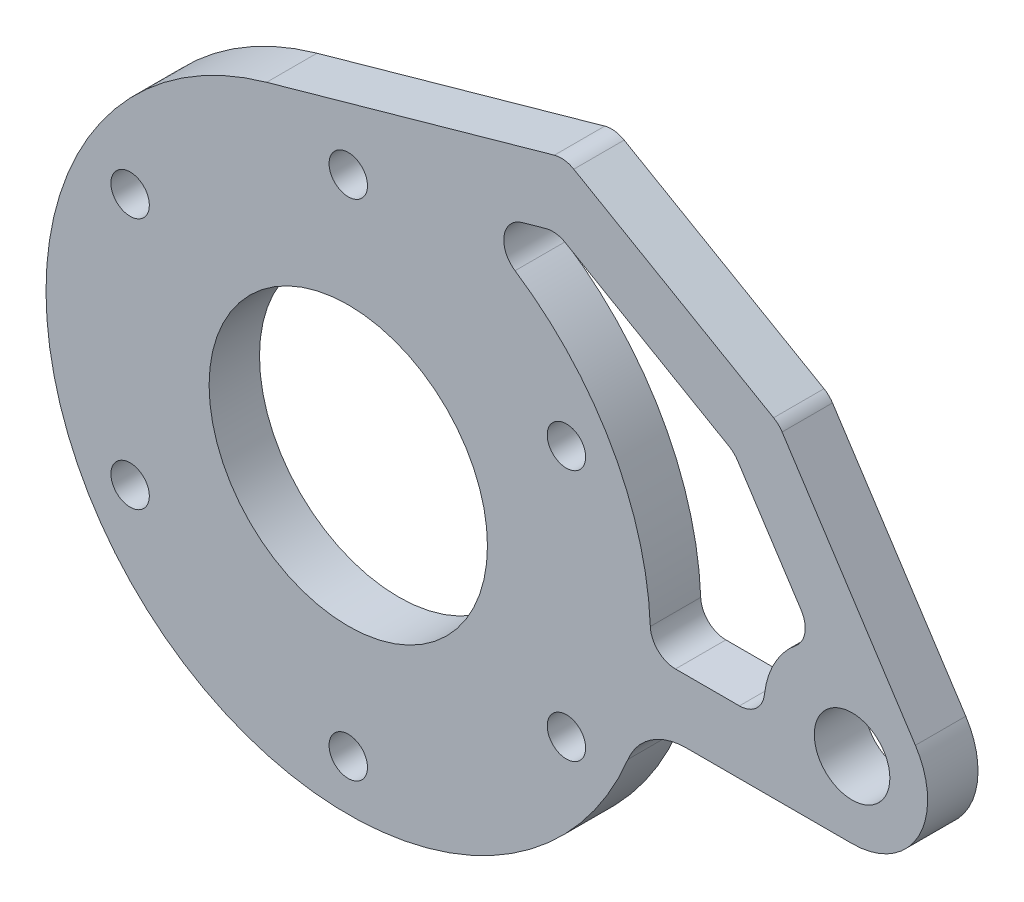
ISO-10303-21;
HEADER;
FILE_DESCRIPTION(('STEP AP214'),'2;1');
FILE_NAME('part.step','',(''),(''),'','','');
FILE_SCHEMA(('AUTOMOTIVE_DESIGN { 1 0 10303 214 1 1 1 1 }'));
ENDSEC;
DATA;
#1=APPLICATION_CONTEXT('core data for automotive mechanical design processes');
#2=APPLICATION_PROTOCOL_DEFINITION('international standard','automotive_design',2000,#1);
#3=PRODUCT_CONTEXT('',#1,'mechanical');
#4=PRODUCT('Part','Part','',(#3));
#5=PRODUCT_RELATED_PRODUCT_CATEGORY('part','',(#4));
#6=PRODUCT_DEFINITION_FORMATION('','',#4);
#7=PRODUCT_DEFINITION_CONTEXT('part definition',#1,'design');
#8=PRODUCT_DEFINITION('design','',#6,#7);
#9=PRODUCT_DEFINITION_SHAPE('','',#8);
#10=(LENGTH_UNIT() NAMED_UNIT(*) SI_UNIT(.MILLI.,.METRE.));
#11=(NAMED_UNIT(*) PLANE_ANGLE_UNIT() SI_UNIT($,.RADIAN.));
#12=(NAMED_UNIT(*) SI_UNIT($,.STERADIAN.) SOLID_ANGLE_UNIT());
#13=UNCERTAINTY_MEASURE_WITH_UNIT(LENGTH_MEASURE(1.E-05),#10,'distance_accuracy_value','');
#14=(GEOMETRIC_REPRESENTATION_CONTEXT(3) GLOBAL_UNCERTAINTY_ASSIGNED_CONTEXT((#13)) GLOBAL_UNIT_ASSIGNED_CONTEXT((#10,
#11,#12)) REPRESENTATION_CONTEXT('',''));
#15=CARTESIAN_POINT('',(0.,0.,0.));
#16=DIRECTION('',(0.,0.,1.));
#17=DIRECTION('',(1.,0.,0.));
#18=AXIS2_PLACEMENT_3D('',#15,#16,#17);
#19=CARTESIAN_POINT('',(0.,0.,4.));
#20=DIRECTION('',(0.,0.,1.));
#21=DIRECTION('',(1.,0.,0.));
#22=AXIS2_PLACEMENT_3D('',#19,#20,#21);
#23=PLANE('',#22);
#24=CARTESIAN_POINT('',(0.,0.,4.));
#25=DIRECTION('',(0.,0.,-1.));
#26=DIRECTION('',(1.,0.,0.));
#27=AXIS2_PLACEMENT_3D('',#24,#25,#26);
#28=CIRCLE('',#27,24.);
#29=CARTESIAN_POINT('',(13.2429163100525,20.0156230881016,4.));
#30=VERTEX_POINT('',#29);
#31=CARTESIAN_POINT('',(23.9822419509537,0.923076923076928,4.));
#32=VERTEX_POINT('',#31);
#33=EDGE_CURVE('E378',#30,#32,#28,.T.);
#34=ORIENTED_EDGE('',*,*,#33,.F.);
#35=CARTESIAN_POINT('',(14.3464926692235,21.6835916787768,4.));
#36=DIRECTION('',(0.,0.,1.));
#37=DIRECTION('',(1.,0.,0.));
#38=AXIS2_PLACEMENT_3D('',#35,#36,#37);
#39=CIRCLE('',#38,2.);
#40=CARTESIAN_POINT('',(13.8060308855486,23.6091827725417,4.));
#41=VERTEX_POINT('',#40);
#42=EDGE_CURVE('E277',#30,#41,#39,.F.);
#43=ORIENTED_EDGE('',*,*,#42,.T.);
#44=DIRECTION('',(-0.962795546882474,-0.270230891837477,0.));
#45=VECTOR('',#44,1.);
#46=CARTESIAN_POINT('',(8.98296698547427,22.2554780703062,4.));
#47=LINE('',#46,#45);
#48=CARTESIAN_POINT('',(15.6877004775392,24.1373169684606,4.));
#49=VERTEX_POINT('',#48);
#50=EDGE_CURVE('E372',#49,#41,#47,.T.);
#51=ORIENTED_EDGE('',*,*,#50,.F.);
#52=CARTESIAN_POINT('',(16.2281622612142,22.2117258746957,4.));
#53=DIRECTION('',(0.,0.,1.));
#54=DIRECTION('',(1.,0.,0.));
#55=AXIS2_PLACEMENT_3D('',#52,#53,#54);
#56=CIRCLE('',#55,2.);
#57=CARTESIAN_POINT('',(17.2281622612142,23.9437766822645,4.));
#58=VERTEX_POINT('',#57);
#59=EDGE_CURVE('E265',#49,#58,#56,.F.);
#60=ORIENTED_EDGE('',*,*,#59,.T.);
#61=DIRECTION('',(-0.866025403784439,0.5,0.));
#62=VECTOR('',#61,1.);
#63=CARTESIAN_POINT('',(16.4986873294363,24.3649392304936,4.));
#64=LINE('',#63,#62);
#65=CARTESIAN_POINT('',(30.2336791807958,16.4350379877938,4.));
#66=VERTEX_POINT('',#65);
#67=EDGE_CURVE('E388',#66,#58,#64,.T.);
#68=ORIENTED_EDGE('',*,*,#67,.F.);
#69=CARTESIAN_POINT('',(29.2336791807958,14.702987180225,4.));
#70=DIRECTION('',(0.,0.,1.));
#71=DIRECTION('',(1.,0.,0.));
#72=AXIS2_PLACEMENT_3D('',#69,#70,#71);
#73=CIRCLE('',#72,2.);
#74=CARTESIAN_POINT('',(30.9097274937982,15.794253441264,4.));
#75=VERTEX_POINT('',#74);
#76=EDGE_CURVE('E269',#66,#75,#73,.F.);
#77=ORIENTED_EDGE('',*,*,#76,.T.);
#78=DIRECTION('',(-0.545633130519513,0.838024156501157,0.));
#79=VECTOR('',#78,1.);
#80=CARTESIAN_POINT('',(30.6484218391784,16.1955862023323,4.));
#81=LINE('',#80,#79);
#82=CARTESIAN_POINT('',(35.9577330740306,8.04114905341355,4.));
#83=VERTEX_POINT('',#82);
#84=EDGE_CURVE('E386',#83,#75,#81,.T.);
#85=ORIENTED_EDGE('',*,*,#84,.F.);
#86=CARTESIAN_POINT('',(34.2816847610283,6.94988279237452,4.));
#87=DIRECTION('',(0.,0.,1.));
#88=DIRECTION('',(1.,0.,0.));
#89=AXIS2_PLACEMENT_3D('',#86,#87,#88);
#90=CIRCLE('',#89,2.);
#91=CARTESIAN_POINT('',(35.5524214807998,5.40546439406907,4.));
#92=VERTEX_POINT('',#91);
#93=EDGE_CURVE('E273',#83,#92,#90,.F.);
#94=ORIENTED_EDGE('',*,*,#93,.T.);
#95=CARTESIAN_POINT('',(40.,0.,4.));
#96=DIRECTION('',(0.,0.,-1.));
#97=DIRECTION('',(1.,0.,0.));
#98=AXIS2_PLACEMENT_3D('',#95,#96,#97);
#99=CIRCLE('',#98,7.);
#100=CARTESIAN_POINT('',(33.0433440700006,0.777777777777782,4.));
#101=VERTEX_POINT('',#100);
#102=EDGE_CURVE('E383',#101,#92,#99,.T.);
#103=ORIENTED_EDGE('',*,*,#102,.F.);
#104=CARTESIAN_POINT('',(31.0557280900008,1.00000000000001,4.));
#105=DIRECTION('',(0.,0.,1.));
#106=DIRECTION('',(1.,0.,0.));
#107=AXIS2_PLACEMENT_3D('',#104,#105,#106);
#108=CIRCLE('',#107,2.);
#109=CARTESIAN_POINT('',(31.0557280900008,-0.999999999999995,4.));
#110=VERTEX_POINT('',#109);
#111=EDGE_CURVE('E43',#101,#110,#108,.F.);
#112=ORIENTED_EDGE('',*,*,#111,.T.);
#113=DIRECTION('',(1.,0.,0.));
#114=VECTOR('',#113,1.);
#115=CARTESIAN_POINT('',(23.9791576165636,-0.999999999999995,4.));
#116=LINE('',#115,#114);
#117=CARTESIAN_POINT('',(25.9807621135332,-0.999999999999995,4.));
#118=VERTEX_POINT('',#117);
#119=EDGE_CURVE('E381',#118,#110,#116,.T.);
#120=ORIENTED_EDGE('',*,*,#119,.F.);
#121=CARTESIAN_POINT('',(25.9807621135332,1.00000000000001,4.));
#122=DIRECTION('',(0.,0.,1.));
#123=DIRECTION('',(1.,0.,0.));
#124=AXIS2_PLACEMENT_3D('',#121,#122,#123);
#125=CIRCLE('',#124,2.);
#126=EDGE_CURVE('E57',#118,#32,#125,.F.);
#127=ORIENTED_EDGE('',*,*,#126,.T.);
#128=EDGE_LOOP('',(#34,#43,#51,#60,#68,#77,#85,#94,#103,#112,#120,#127));
#129=FACE_BOUND('',#128,.T.);
#130=CARTESIAN_POINT('',(0.,20.,4.));
#131=DIRECTION('',(0.,0.,1.));
#132=DIRECTION('',(1.,0.,0.));
#133=AXIS2_PLACEMENT_3D('',#130,#131,#132);
#134=CIRCLE('',#133,1.525);
#135=CARTESIAN_POINT('',(1.525,20.,4.));
#136=VERTEX_POINT('',#135);
#137=EDGE_CURVE('E393',#136,#136,#134,.T.);
#138=ORIENTED_EDGE('',*,*,#137,.F.);
#139=EDGE_LOOP('',(#138));
#140=FACE_BOUND('',#139,.T.);
#141=CARTESIAN_POINT('',(-17.3205080756888,9.99999999999999,4.));
#142=DIRECTION('',(0.,0.,1.));
#143=DIRECTION('',(1.,0.,0.));
#144=AXIS2_PLACEMENT_3D('',#141,#142,#143);
#145=CIRCLE('',#144,1.525);
#146=CARTESIAN_POINT('',(-15.7955080756888,9.99999999999999,4.));
#147=VERTEX_POINT('',#146);
#148=EDGE_CURVE('E298',#147,#147,#145,.T.);
#149=ORIENTED_EDGE('',*,*,#148,.F.);
#150=EDGE_LOOP('',(#149));
#151=FACE_BOUND('',#150,.T.);
#152=CARTESIAN_POINT('',(-17.3205080756888,-10.,4.));
#153=DIRECTION('',(0.,0.,1.));
#154=DIRECTION('',(1.,0.,0.));
#155=AXIS2_PLACEMENT_3D('',#152,#153,#154);
#156=CIRCLE('',#155,1.525);
#157=CARTESIAN_POINT('',(-15.7955080756888,-10.,4.));
#158=VERTEX_POINT('',#157);
#159=EDGE_CURVE('E406',#158,#158,#156,.T.);
#160=ORIENTED_EDGE('',*,*,#159,.F.);
#161=EDGE_LOOP('',(#160));
#162=FACE_BOUND('',#161,.T.);
#163=CARTESIAN_POINT('',(0.,-20.,4.));
#164=DIRECTION('',(0.,0.,1.));
#165=DIRECTION('',(1.,0.,0.));
#166=AXIS2_PLACEMENT_3D('',#163,#164,#165);
#167=CIRCLE('',#166,1.525);
#168=CARTESIAN_POINT('',(1.525,-20.,4.));
#169=VERTEX_POINT('',#168);
#170=EDGE_CURVE('E419',#169,#169,#167,.T.);
#171=ORIENTED_EDGE('',*,*,#170,.F.);
#172=EDGE_LOOP('',(#171));
#173=FACE_BOUND('',#172,.T.);
#174=CARTESIAN_POINT('',(17.3205080756888,-10.,4.));
#175=DIRECTION('',(0.,0.,1.));
#176=DIRECTION('',(1.,0.,0.));
#177=AXIS2_PLACEMENT_3D('',#174,#175,#176);
#178=CIRCLE('',#177,1.525);
#179=CARTESIAN_POINT('',(18.8455080756888,-10.,4.));
#180=VERTEX_POINT('',#179);
#181=EDGE_CURVE('E413',#180,#180,#178,.T.);
#182=ORIENTED_EDGE('',*,*,#181,.F.);
#183=EDGE_LOOP('',(#182));
#184=FACE_BOUND('',#183,.T.);
#185=CARTESIAN_POINT('',(17.3205080756888,10.,4.));
#186=DIRECTION('',(0.,0.,1.));
#187=DIRECTION('',(1.,0.,0.));
#188=AXIS2_PLACEMENT_3D('',#185,#186,#187);
#189=CIRCLE('',#188,1.525);
#190=CARTESIAN_POINT('',(18.8455080756888,10.,4.));
#191=VERTEX_POINT('',#190);
#192=EDGE_CURVE('E407',#191,#191,#189,.T.);
#193=ORIENTED_EDGE('',*,*,#192,.F.);
#194=EDGE_LOOP('',(#193));
#195=FACE_BOUND('',#194,.T.);
#196=DIRECTION('',(-0.545633130519513,0.838024156501157,0.));
#197=VECTOR('',#196,1.);
#198=CARTESIAN_POINT('',(34.1852784851347,19.9270837576005,4.));
#199=LINE('',#198,#197);
#200=CARTESIAN_POINT('',(45.0281449390069,3.27379878311708,4.));
#201=VERTEX_POINT('',#200);
#202=CARTESIAN_POINT('',(34.4465841397545,19.5257509965322,4.));
#203=VERTEX_POINT('',#202);
#204=EDGE_CURVE('E400',#201,#203,#199,.T.);
#205=ORIENTED_EDGE('',*,*,#204,.T.);
#206=CARTESIAN_POINT('',(32.7705358267522,18.4344847354932,4.));
#207=DIRECTION('',(0.,0.,1.));
#208=DIRECTION('',(1.,0.,0.));
#209=AXIS2_PLACEMENT_3D('',#206,#207,#208);
#210=CIRCLE('',#209,2.);
#211=CARTESIAN_POINT('',(33.7705358267522,20.1665355430621,4.));
#212=VERTEX_POINT('',#211);
#213=EDGE_CURVE('E216',#203,#212,#210,.T.);
#214=ORIENTED_EDGE('',*,*,#213,.T.);
#215=DIRECTION('',(-0.866025403784429,0.500000000000016,0.));
#216=VECTOR('',#215,1.);
#217=CARTESIAN_POINT('',(34.1852784851347,19.9270837576005,4.));
#218=LINE('',#217,#216);
#219=CARTESIAN_POINT('',(17.9044749317701,29.3268100717594,4.));
#220=VERTEX_POINT('',#219);
#221=EDGE_CURVE('E189',#212,#220,#218,.T.);
#222=ORIENTED_EDGE('',*,*,#221,.T.);
#223=CARTESIAN_POINT('',(16.9044749317701,27.5947592641905,4.));
#224=DIRECTION('',(0.,0.,1.));
#225=DIRECTION('',(1.,0.,0.));
#226=AXIS2_PLACEMENT_3D('',#223,#224,#225);
#227=CIRCLE('',#226,2.);
#228=CARTESIAN_POINT('',(16.3640131480951,29.5203503579555,4.));
#229=VERTEX_POINT('',#228);
#230=EDGE_CURVE('E185',#220,#229,#227,.T.);
#231=ORIENTED_EDGE('',*,*,#230,.T.);
#232=DIRECTION('',(-0.962795546882474,-0.270230891837478,0.));
#233=VECTOR('',#232,1.);
#234=CARTESIAN_POINT('',(17.1749999999923,29.7479726199884,4.));
#235=LINE('',#234,#233);
#236=CARTESIAN_POINT('',(-6.48554140409947,23.1070931251794,4.));
#237=VERTEX_POINT('',#236);
#238=EDGE_CURVE('E178',#229,#237,#235,.T.);
#239=ORIENTED_EDGE('',*,*,#238,.T.);
#240=CARTESIAN_POINT('',(0.,0.,4.));
#241=DIRECTION('',(0.,0.,1.));
#242=DIRECTION('',(1.,0.,0.));
#243=AXIS2_PLACEMENT_3D('',#240,#241,#242);
#244=CIRCLE('',#243,24.);
#245=CARTESIAN_POINT('',(22.2064681903427,-9.10344827586206,4.));
#246=VERTEX_POINT('',#245);
#247=EDGE_CURVE('E183',#237,#246,#244,.T.);
#248=ORIENTED_EDGE('',*,*,#247,.T.);
#249=CARTESIAN_POINT('',(26.8328157299975,-11.,4.));
#250=DIRECTION('',(0.,0.,1.));
#251=DIRECTION('',(1.,0.,0.));
#252=AXIS2_PLACEMENT_3D('',#249,#250,#251);
#253=CIRCLE('',#252,5.);
#254=CARTESIAN_POINT('',(26.8328157299975,-5.99999999999999,4.));
#255=VERTEX_POINT('',#254);
#256=EDGE_CURVE('E232',#246,#255,#253,.F.);
#257=ORIENTED_EDGE('',*,*,#256,.T.);
#258=DIRECTION('',(1.,0.,0.));
#259=VECTOR('',#258,1.);
#260=CARTESIAN_POINT('',(40.,-5.99999999999999,4.));
#261=LINE('',#260,#259);
#262=CARTESIAN_POINT('',(40.,-5.99999999999999,4.));
#263=VERTEX_POINT('',#262);
#264=EDGE_CURVE('E452',#255,#263,#261,.T.);
#265=ORIENTED_EDGE('',*,*,#264,.T.);
#266=CARTESIAN_POINT('',(40.,0.,4.));
#267=DIRECTION('',(0.,0.,1.));
#268=DIRECTION('',(1.,0.,0.));
#269=AXIS2_PLACEMENT_3D('',#266,#267,#268);
#270=CIRCLE('',#269,5.99999999999999);
#271=EDGE_CURVE('E449',#263,#201,#270,.T.);
#272=ORIENTED_EDGE('',*,*,#271,.T.);
#273=EDGE_LOOP('',(#205,#214,#222,#231,#239,#248,#257,#265,#272));
#274=FACE_BOUND('',#273,.T.);
#275=CARTESIAN_POINT('',(0.,0.,4.));
#276=DIRECTION('',(0.,0.,1.));
#277=DIRECTION('',(1.,0.,0.));
#278=AXIS2_PLACEMENT_3D('',#275,#276,#277);
#279=CIRCLE('',#278,11.05);
#280=CARTESIAN_POINT('',(11.05,0.,4.));
#281=VERTEX_POINT('',#280);
#282=EDGE_CURVE('E209',#281,#281,#279,.T.);
#283=ORIENTED_EDGE('',*,*,#282,.F.);
#284=EDGE_LOOP('',(#283));
#285=FACE_BOUND('',#284,.T.);
#286=CARTESIAN_POINT('',(40.,0.,4.));
#287=DIRECTION('',(0.,0.,1.));
#288=DIRECTION('',(1.,0.,0.));
#289=AXIS2_PLACEMENT_3D('',#286,#287,#288);
#290=CIRCLE('',#289,3.);
#291=CARTESIAN_POINT('',(43.,0.,4.));
#292=VERTEX_POINT('',#291);
#293=EDGE_CURVE('E439',#292,#292,#290,.T.);
#294=ORIENTED_EDGE('',*,*,#293,.F.);
#295=EDGE_LOOP('',(#294));
#296=FACE_BOUND('',#295,.T.);
#297=ADVANCED_FACE('F35',(#129,#140,#151,#162,#173,#184,#195,#274,#285,#296),#23,.T.);
#298=CARTESIAN_POINT('',(0.,0.,0.));
#299=DIRECTION('',(0.,0.,1.));
#300=DIRECTION('',(1.,0.,0.));
#301=AXIS2_PLACEMENT_3D('',#298,#299,#300);
#302=PLANE('',#301);
#303=DIRECTION('',(0.962795546882474,0.270230891837477,0.));
#304=VECTOR('',#303,1.);
#305=CARTESIAN_POINT('',(8.98296698547427,22.2554780703062,0.));
#306=LINE('',#305,#304);
#307=CARTESIAN_POINT('',(13.8060308855486,23.6091827725417,0.));
#308=VERTEX_POINT('',#307);
#309=CARTESIAN_POINT('',(15.6877004775392,24.1373169684606,0.));
#310=VERTEX_POINT('',#309);
#311=EDGE_CURVE('E370',#308,#310,#306,.T.);
#312=ORIENTED_EDGE('',*,*,#311,.F.);
#313=CARTESIAN_POINT('',(14.3464926692235,21.6835916787768,0.));
#314=DIRECTION('',(0.,0.,1.));
#315=DIRECTION('',(1.,0.,0.));
#316=AXIS2_PLACEMENT_3D('',#313,#314,#315);
#317=CIRCLE('',#316,2.);
#318=CARTESIAN_POINT('',(13.2429163100525,20.0156230881016,0.));
#319=VERTEX_POINT('',#318);
#320=EDGE_CURVE('E279',#308,#319,#317,.T.);
#321=ORIENTED_EDGE('',*,*,#320,.T.);
#322=CARTESIAN_POINT('',(0.,0.,0.));
#323=DIRECTION('',(0.,0.,1.));
#324=DIRECTION('',(1.,0.,0.));
#325=AXIS2_PLACEMENT_3D('',#322,#323,#324);
#326=CIRCLE('',#325,24.);
#327=CARTESIAN_POINT('',(23.9822419509537,0.923076923076928,0.));
#328=VERTEX_POINT('',#327);
#329=EDGE_CURVE('E294',#328,#319,#326,.T.);
#330=ORIENTED_EDGE('',*,*,#329,.F.);
#331=CARTESIAN_POINT('',(25.9807621135332,1.00000000000001,0.));
#332=DIRECTION('',(0.,0.,1.));
#333=DIRECTION('',(1.,0.,0.));
#334=AXIS2_PLACEMENT_3D('',#331,#332,#333);
#335=CIRCLE('',#334,2.);
#336=CARTESIAN_POINT('',(25.9807621135332,-0.999999999999995,0.));
#337=VERTEX_POINT('',#336);
#338=EDGE_CURVE('E282',#328,#337,#335,.T.);
#339=ORIENTED_EDGE('',*,*,#338,.T.);
#340=DIRECTION('',(-1.,0.,0.));
#341=VECTOR('',#340,1.);
#342=CARTESIAN_POINT('',(23.9791576165636,-0.999999999999995,0.));
#343=LINE('',#342,#341);
#344=CARTESIAN_POINT('',(31.0557280900008,-0.999999999999995,0.));
#345=VERTEX_POINT('',#344);
#346=EDGE_CURVE('E291',#345,#337,#343,.T.);
#347=ORIENTED_EDGE('',*,*,#346,.F.);
#348=CARTESIAN_POINT('',(31.0557280900008,1.00000000000001,0.));
#349=DIRECTION('',(0.,0.,1.));
#350=DIRECTION('',(1.,0.,0.));
#351=AXIS2_PLACEMENT_3D('',#348,#349,#350);
#352=CIRCLE('',#351,2.);
#353=CARTESIAN_POINT('',(33.0433440700006,0.777777777777782,0.));
#354=VERTEX_POINT('',#353);
#355=EDGE_CURVE('E11',#345,#354,#352,.T.);
#356=ORIENTED_EDGE('',*,*,#355,.T.);
#357=CARTESIAN_POINT('',(40.,0.,0.));
#358=DIRECTION('',(0.,0.,1.));
#359=DIRECTION('',(1.,0.,0.));
#360=AXIS2_PLACEMENT_3D('',#357,#358,#359);
#361=CIRCLE('',#360,7.);
#362=CARTESIAN_POINT('',(35.5524214807998,5.40546439406907,0.));
#363=VERTEX_POINT('',#362);
#364=EDGE_CURVE('E361',#363,#354,#361,.T.);
#365=ORIENTED_EDGE('',*,*,#364,.F.);
#366=CARTESIAN_POINT('',(34.2816847610283,6.94988279237452,0.));
#367=DIRECTION('',(0.,0.,1.));
#368=DIRECTION('',(1.,0.,0.));
#369=AXIS2_PLACEMENT_3D('',#366,#367,#368);
#370=CIRCLE('',#369,2.);
#371=CARTESIAN_POINT('',(35.9577330740306,8.04114905341355,0.));
#372=VERTEX_POINT('',#371);
#373=EDGE_CURVE('E275',#363,#372,#370,.T.);
#374=ORIENTED_EDGE('',*,*,#373,.T.);
#375=DIRECTION('',(0.545633130519513,-0.838024156501157,0.));
#376=VECTOR('',#375,1.);
#377=CARTESIAN_POINT('',(30.6484218391784,16.1955862023323,0.));
#378=LINE('',#377,#376);
#379=CARTESIAN_POINT('',(30.9097274937982,15.794253441264,0.));
#380=VERTEX_POINT('',#379);
#381=EDGE_CURVE('E358',#380,#372,#378,.T.);
#382=ORIENTED_EDGE('',*,*,#381,.F.);
#383=CARTESIAN_POINT('',(29.2336791807958,14.702987180225,0.));
#384=DIRECTION('',(0.,0.,1.));
#385=DIRECTION('',(1.,0.,0.));
#386=AXIS2_PLACEMENT_3D('',#383,#384,#385);
#387=CIRCLE('',#386,2.);
#388=CARTESIAN_POINT('',(30.2336791807958,16.4350379877938,0.));
#389=VERTEX_POINT('',#388);
#390=EDGE_CURVE('E271',#380,#389,#387,.T.);
#391=ORIENTED_EDGE('',*,*,#390,.T.);
#392=DIRECTION('',(0.866025403784439,-0.5,0.));
#393=VECTOR('',#392,1.);
#394=CARTESIAN_POINT('',(16.4986873294363,24.3649392304936,0.));
#395=LINE('',#394,#393);
#396=CARTESIAN_POINT('',(17.2281622612142,23.9437766822645,0.));
#397=VERTEX_POINT('',#396);
#398=EDGE_CURVE('E367',#397,#389,#395,.T.);
#399=ORIENTED_EDGE('',*,*,#398,.F.);
#400=CARTESIAN_POINT('',(16.2281622612142,22.2117258746957,0.));
#401=DIRECTION('',(0.,0.,1.));
#402=DIRECTION('',(1.,0.,0.));
#403=AXIS2_PLACEMENT_3D('',#400,#401,#402);
#404=CIRCLE('',#403,2.);
#405=EDGE_CURVE('E267',#397,#310,#404,.T.);
#406=ORIENTED_EDGE('',*,*,#405,.T.);
#407=EDGE_LOOP('',(#312,#321,#330,#339,#347,#356,#365,#374,#382,#391,#399,#406));
#408=FACE_BOUND('',#407,.T.);
#409=CARTESIAN_POINT('',(0.,20.,0.));
#410=DIRECTION('',(0.,0.,1.));
#411=DIRECTION('',(1.,0.,0.));
#412=AXIS2_PLACEMENT_3D('',#409,#410,#411);
#413=CIRCLE('',#412,1.525);
#414=CARTESIAN_POINT('',(1.525,20.,0.));
#415=VERTEX_POINT('',#414);
#416=EDGE_CURVE('E396',#415,#415,#413,.F.);
#417=ORIENTED_EDGE('',*,*,#416,.F.);
#418=EDGE_LOOP('',(#417));
#419=FACE_BOUND('',#418,.T.);
#420=CARTESIAN_POINT('',(-17.3205080756888,9.99999999999999,0.));
#421=DIRECTION('',(0.,0.,1.));
#422=DIRECTION('',(1.,0.,0.));
#423=AXIS2_PLACEMENT_3D('',#420,#421,#422);
#424=CIRCLE('',#423,1.525);
#425=CARTESIAN_POINT('',(-15.7955080756888,9.99999999999999,0.));
#426=VERTEX_POINT('',#425);
#427=EDGE_CURVE('E403',#426,#426,#424,.F.);
#428=ORIENTED_EDGE('',*,*,#427,.F.);
#429=EDGE_LOOP('',(#428));
#430=FACE_BOUND('',#429,.T.);
#431=CARTESIAN_POINT('',(-17.3205080756888,-10.,0.));
#432=DIRECTION('',(0.,0.,1.));
#433=DIRECTION('',(1.,0.,0.));
#434=AXIS2_PLACEMENT_3D('',#431,#432,#433);
#435=CIRCLE('',#434,1.525);
#436=CARTESIAN_POINT('',(-15.7955080756888,-10.,0.));
#437=VERTEX_POINT('',#436);
#438=EDGE_CURVE('E422',#437,#437,#435,.F.);
#439=ORIENTED_EDGE('',*,*,#438,.F.);
#440=EDGE_LOOP('',(#439));
#441=FACE_BOUND('',#440,.T.);
#442=CARTESIAN_POINT('',(0.,-20.,0.));
#443=DIRECTION('',(0.,0.,1.));
#444=DIRECTION('',(1.,0.,0.));
#445=AXIS2_PLACEMENT_3D('',#442,#443,#444);
#446=CIRCLE('',#445,1.525);
#447=CARTESIAN_POINT('',(1.525,-20.,0.));
#448=VERTEX_POINT('',#447);
#449=EDGE_CURVE('E416',#448,#448,#446,.F.);
#450=ORIENTED_EDGE('',*,*,#449,.F.);
#451=EDGE_LOOP('',(#450));
#452=FACE_BOUND('',#451,.T.);
#453=CARTESIAN_POINT('',(17.3205080756888,-10.,0.));
#454=DIRECTION('',(0.,0.,1.));
#455=DIRECTION('',(1.,0.,0.));
#456=AXIS2_PLACEMENT_3D('',#453,#454,#455);
#457=CIRCLE('',#456,1.525);
#458=CARTESIAN_POINT('',(18.8455080756888,-10.,0.));
#459=VERTEX_POINT('',#458);
#460=EDGE_CURVE('E410',#459,#459,#457,.F.);
#461=ORIENTED_EDGE('',*,*,#460,.F.);
#462=EDGE_LOOP('',(#461));
#463=FACE_BOUND('',#462,.T.);
#464=CARTESIAN_POINT('',(17.3205080756888,10.,0.));
#465=DIRECTION('',(0.,0.,1.));
#466=DIRECTION('',(1.,0.,0.));
#467=AXIS2_PLACEMENT_3D('',#464,#465,#466);
#468=CIRCLE('',#467,1.525);
#469=CARTESIAN_POINT('',(18.8455080756888,10.,0.));
#470=VERTEX_POINT('',#469);
#471=EDGE_CURVE('E397',#470,#470,#468,.F.);
#472=ORIENTED_EDGE('',*,*,#471,.F.);
#473=EDGE_LOOP('',(#472));
#474=FACE_BOUND('',#473,.T.);
#475=DIRECTION('',(0.866025403784429,-0.500000000000016,0.));
#476=VECTOR('',#475,1.);
#477=CARTESIAN_POINT('',(34.1852784851347,19.9270837576005,0.));
#478=LINE('',#477,#476);
#479=CARTESIAN_POINT('',(17.9044749317701,29.3268100717594,0.));
#480=VERTEX_POINT('',#479);
#481=CARTESIAN_POINT('',(33.7705358267522,20.1665355430621,0.));
#482=VERTEX_POINT('',#481);
#483=EDGE_CURVE('E432',#480,#482,#478,.T.);
#484=ORIENTED_EDGE('',*,*,#483,.T.);
#485=CARTESIAN_POINT('',(32.7705358267522,18.4344847354932,0.));
#486=DIRECTION('',(0.,0.,1.));
#487=DIRECTION('',(1.,0.,0.));
#488=AXIS2_PLACEMENT_3D('',#485,#486,#487);
#489=CIRCLE('',#488,2.);
#490=CARTESIAN_POINT('',(34.4465841397545,19.5257509965322,0.));
#491=VERTEX_POINT('',#490);
#492=EDGE_CURVE('E225',#482,#491,#489,.F.);
#493=ORIENTED_EDGE('',*,*,#492,.T.);
#494=DIRECTION('',(0.545633130519513,-0.838024156501158,0.));
#495=VECTOR('',#494,1.);
#496=CARTESIAN_POINT('',(34.1852784851347,19.9270837576005,0.));
#497=LINE('',#496,#495);
#498=CARTESIAN_POINT('',(45.0281449390069,3.27379878311707,0.));
#499=VERTEX_POINT('',#498);
#500=EDGE_CURVE('E430',#491,#499,#497,.T.);
#501=ORIENTED_EDGE('',*,*,#500,.T.);
#502=CARTESIAN_POINT('',(40.,0.,0.));
#503=DIRECTION('',(0.,0.,1.));
#504=DIRECTION('',(1.,0.,0.));
#505=AXIS2_PLACEMENT_3D('',#502,#503,#504);
#506=CIRCLE('',#505,5.99999999999999);
#507=CARTESIAN_POINT('',(40.,-5.99999999999999,0.));
#508=VERTEX_POINT('',#507);
#509=EDGE_CURVE('E443',#499,#508,#506,.F.);
#510=ORIENTED_EDGE('',*,*,#509,.T.);
#511=DIRECTION('',(-1.,0.,0.));
#512=VECTOR('',#511,1.);
#513=CARTESIAN_POINT('',(40.,-5.99999999999999,0.));
#514=LINE('',#513,#512);
#515=CARTESIAN_POINT('',(26.8328157299975,-5.99999999999999,0.));
#516=VERTEX_POINT('',#515);
#517=EDGE_CURVE('E440',#508,#516,#514,.T.);
#518=ORIENTED_EDGE('',*,*,#517,.T.);
#519=CARTESIAN_POINT('',(26.8328157299975,-11.,0.));
#520=DIRECTION('',(0.,0.,1.));
#521=DIRECTION('',(1.,0.,0.));
#522=AXIS2_PLACEMENT_3D('',#519,#520,#521);
#523=CIRCLE('',#522,5.);
#524=CARTESIAN_POINT('',(22.2064681903427,-9.10344827586206,0.));
#525=VERTEX_POINT('',#524);
#526=EDGE_CURVE('E234',#516,#525,#523,.T.);
#527=ORIENTED_EDGE('',*,*,#526,.T.);
#528=CARTESIAN_POINT('',(0.,0.,0.));
#529=DIRECTION('',(0.,0.,1.));
#530=DIRECTION('',(1.,0.,0.));
#531=AXIS2_PLACEMENT_3D('',#528,#529,#530);
#532=CIRCLE('',#531,24.);
#533=CARTESIAN_POINT('',(-6.48554140409947,23.1070931251794,0.));
#534=VERTEX_POINT('',#533);
#535=EDGE_CURVE('E205',#534,#525,#532,.T.);
#536=ORIENTED_EDGE('',*,*,#535,.F.);
#537=DIRECTION('',(0.962795546882474,0.270230891837478,0.));
#538=VECTOR('',#537,1.);
#539=CARTESIAN_POINT('',(17.1749999999923,29.7479726199884,0.));
#540=LINE('',#539,#538);
#541=CARTESIAN_POINT('',(16.3640131480951,29.5203503579555,0.));
#542=VERTEX_POINT('',#541);
#543=EDGE_CURVE('E194',#534,#542,#540,.T.);
#544=ORIENTED_EDGE('',*,*,#543,.T.);
#545=CARTESIAN_POINT('',(16.9044749317701,27.5947592641905,0.));
#546=DIRECTION('',(0.,0.,1.));
#547=DIRECTION('',(1.,0.,0.));
#548=AXIS2_PLACEMENT_3D('',#545,#546,#547);
#549=CIRCLE('',#548,2.);
#550=EDGE_CURVE('E223',#542,#480,#549,.F.);
#551=ORIENTED_EDGE('',*,*,#550,.T.);
#552=EDGE_LOOP('',(#484,#493,#501,#510,#518,#527,#536,#544,#551));
#553=FACE_BOUND('',#552,.T.);
#554=CARTESIAN_POINT('',(0.,0.,0.));
#555=DIRECTION('',(0.,0.,1.));
#556=DIRECTION('',(1.,0.,0.));
#557=AXIS2_PLACEMENT_3D('',#554,#555,#556);
#558=CIRCLE('',#557,11.05);
#559=CARTESIAN_POINT('',(11.05,0.,0.));
#560=VERTEX_POINT('',#559);
#561=EDGE_CURVE('E212',#560,#560,#558,.T.);
#562=ORIENTED_EDGE('',*,*,#561,.T.);
#563=EDGE_LOOP('',(#562));
#564=FACE_BOUND('',#563,.T.);
#565=CARTESIAN_POINT('',(40.,0.,0.));
#566=DIRECTION('',(0.,0.,1.));
#567=DIRECTION('',(1.,0.,0.));
#568=AXIS2_PLACEMENT_3D('',#565,#566,#567);
#569=CIRCLE('',#568,3.);
#570=CARTESIAN_POINT('',(43.,0.,0.));
#571=VERTEX_POINT('',#570);
#572=EDGE_CURVE('E446',#571,#571,#569,.F.);
#573=ORIENTED_EDGE('',*,*,#572,.F.);
#574=EDGE_LOOP('',(#573));
#575=FACE_BOUND('',#574,.T.);
#576=ADVANCED_FACE('F289',(#408,#419,#430,#441,#452,#463,#474,#553,#564,#575),#302,.F.);
#577=CARTESIAN_POINT('',(0.,0.,4.));
#578=DIRECTION('',(0.,0.,-1.));
#579=DIRECTION('',(-1.,0.,0.));
#580=AXIS2_PLACEMENT_3D('',#577,#578,#579);
#581=CYLINDRICAL_SURFACE('',#580,24.);
#582=ORIENTED_EDGE('',*,*,#535,.T.);
#583=DIRECTION('',(0.,0.,-1.));
#584=VECTOR('',#583,1.);
#585=CARTESIAN_POINT('',(22.2064681903427,-9.10344827586207,4.));
#586=LINE('',#585,#584);
#587=EDGE_CURVE('E203',#525,#246,#586,.F.);
#588=ORIENTED_EDGE('',*,*,#587,.T.);
#589=ORIENTED_EDGE('',*,*,#247,.F.);
#590=DIRECTION('',(0.,0.,1.));
#591=VECTOR('',#590,1.);
#592=CARTESIAN_POINT('',(-6.48554140409947,23.1070931251794,-57.9184060640556));
#593=LINE('',#592,#591);
#594=EDGE_CURVE('E188',#534,#237,#593,.T.);
#595=ORIENTED_EDGE('',*,*,#594,.F.);
#596=EDGE_LOOP('',(#582,#588,#589,#595));
#597=FACE_BOUND('',#596,.T.);
#598=ADVANCED_FACE('F201',(#597),#581,.T.);
#599=CARTESIAN_POINT('',(0.,0.,4.));
#600=DIRECTION('',(0.,0.,-1.));
#601=DIRECTION('',(-1.,0.,0.));
#602=AXIS2_PLACEMENT_3D('',#599,#600,#601);
#603=CYLINDRICAL_SURFACE('',#602,11.05);
#604=ORIENTED_EDGE('',*,*,#282,.T.);
#605=EDGE_LOOP('',(#604));
#606=FACE_BOUND('',#605,.T.);
#607=ORIENTED_EDGE('',*,*,#561,.F.);
#608=EDGE_LOOP('',(#607));
#609=FACE_BOUND('',#608,.T.);
#610=ADVANCED_FACE('F321',(#606,#609),#603,.F.);
#611=CARTESIAN_POINT('',(40.,-5.99999999999999,-25.7315602498859));
#612=DIRECTION('',(0.,-1.,0.));
#613=DIRECTION('',(0.,0.,-1.));
#614=AXIS2_PLACEMENT_3D('',#611,#612,#613);
#615=PLANE('',#614);
#616=ORIENTED_EDGE('',*,*,#264,.F.);
#617=DIRECTION('',(0.,0.,-1.));
#618=VECTOR('',#617,1.);
#619=CARTESIAN_POINT('',(26.8328157299975,-5.99999999999999,-25.7315602498859));
#620=LINE('',#619,#618);
#621=EDGE_CURVE('E230',#255,#516,#620,.T.);
#622=ORIENTED_EDGE('',*,*,#621,.T.);
#623=ORIENTED_EDGE('',*,*,#517,.F.);
#624=DIRECTION('',(0.,0.,1.));
#625=VECTOR('',#624,1.);
#626=CARTESIAN_POINT('',(40.,-5.99999999999999,-25.7315602498859));
#627=LINE('',#626,#625);
#628=EDGE_CURVE('E444',#508,#263,#627,.T.);
#629=ORIENTED_EDGE('',*,*,#628,.T.);
#630=EDGE_LOOP('',(#616,#622,#623,#629));
#631=FACE_BOUND('',#630,.T.);
#632=ADVANCED_FACE('F466',(#631),#615,.T.);
#633=CARTESIAN_POINT('',(40.,0.,-25.7315602498859));
#634=DIRECTION('',(0.,0.,1.));
#635=DIRECTION('',(1.,0.,0.));
#636=AXIS2_PLACEMENT_3D('',#633,#634,#635);
#637=CYLINDRICAL_SURFACE('',#636,5.99999999999999);
#638=DIRECTION('',(0.,0.,1.));
#639=VECTOR('',#638,1.);
#640=CARTESIAN_POINT('',(45.0281449390069,3.27379878311708,-57.9184060640556));
#641=LINE('',#640,#639);
#642=EDGE_CURVE('E198',#499,#201,#641,.T.);
#643=ORIENTED_EDGE('',*,*,#642,.T.);
#644=ORIENTED_EDGE('',*,*,#271,.F.);
#645=ORIENTED_EDGE('',*,*,#628,.F.);
#646=ORIENTED_EDGE('',*,*,#509,.F.);
#647=EDGE_LOOP('',(#643,#644,#645,#646));
#648=FACE_BOUND('',#647,.T.);
#649=ADVANCED_FACE('F472',(#648),#637,.T.);
#650=CARTESIAN_POINT('',(40.,0.,-25.7315602498859));
#651=DIRECTION('',(0.,0.,1.));
#652=DIRECTION('',(1.,0.,0.));
#653=AXIS2_PLACEMENT_3D('',#650,#651,#652);
#654=CYLINDRICAL_SURFACE('',#653,3.);
#655=ORIENTED_EDGE('',*,*,#572,.T.);
#656=EDGE_LOOP('',(#655));
#657=FACE_BOUND('',#656,.T.);
#658=ORIENTED_EDGE('',*,*,#293,.T.);
#659=EDGE_LOOP('',(#658));
#660=FACE_BOUND('',#659,.T.);
#661=ADVANCED_FACE('F478',(#657,#660),#654,.F.);
#662=CARTESIAN_POINT('',(34.1852784851347,19.9270837576005,-57.9184060640556));
#663=DIRECTION('',(0.838024156501158,0.545633130519513,0.));
#664=DIRECTION('',(-0.545633130519513,0.838024156501158,0.));
#665=AXIS2_PLACEMENT_3D('',#662,#663,#664);
#666=PLANE('',#665);
#667=ORIENTED_EDGE('',*,*,#500,.F.);
#668=DIRECTION('',(0.,0.,1.));
#669=VECTOR('',#668,1.);
#670=CARTESIAN_POINT('',(34.4465841397545,19.5257509965322,-57.9184060640556));
#671=LINE('',#670,#669);
#672=EDGE_CURVE('E204',#491,#203,#671,.T.);
#673=ORIENTED_EDGE('',*,*,#672,.T.);
#674=ORIENTED_EDGE('',*,*,#204,.F.);
#675=ORIENTED_EDGE('',*,*,#642,.F.);
#676=EDGE_LOOP('',(#667,#673,#674,#675));
#677=FACE_BOUND('',#676,.T.);
#678=ADVANCED_FACE('F484',(#677),#666,.T.);
#679=CARTESIAN_POINT('',(17.1749999999923,29.7479726199884,-57.9184060640556));
#680=DIRECTION('',(-0.270230891837478,0.962795546882474,0.));
#681=DIRECTION('',(-0.962795546882474,-0.270230891837478,0.));
#682=AXIS2_PLACEMENT_3D('',#679,#680,#681);
#683=PLANE('',#682);
#684=ORIENTED_EDGE('',*,*,#238,.F.);
#685=DIRECTION('',(0.,0.,1.));
#686=VECTOR('',#685,1.);
#687=CARTESIAN_POINT('',(16.3640131480951,29.5203503579555,-57.9184060640556));
#688=LINE('',#687,#686);
#689=EDGE_CURVE('E227',#229,#542,#688,.F.);
#690=ORIENTED_EDGE('',*,*,#689,.T.);
#691=ORIENTED_EDGE('',*,*,#543,.F.);
#692=ORIENTED_EDGE('',*,*,#594,.T.);
#693=EDGE_LOOP('',(#684,#690,#691,#692));
#694=FACE_BOUND('',#693,.T.);
#695=ADVANCED_FACE('F192',(#694),#683,.T.);
#696=CARTESIAN_POINT('',(34.1852784851347,19.9270837576005,-57.9184060640556));
#697=DIRECTION('',(0.500000000000016,0.866025403784429,0.));
#698=DIRECTION('',(-0.866025403784429,0.500000000000016,0.));
#699=AXIS2_PLACEMENT_3D('',#696,#697,#698);
#700=PLANE('',#699);
#701=ORIENTED_EDGE('',*,*,#221,.F.);
#702=DIRECTION('',(0.,0.,1.));
#703=VECTOR('',#702,1.);
#704=CARTESIAN_POINT('',(33.7705358267522,20.1665355430621,-57.9184060640556));
#705=LINE('',#704,#703);
#706=EDGE_CURVE('E221',#212,#482,#705,.F.);
#707=ORIENTED_EDGE('',*,*,#706,.T.);
#708=ORIENTED_EDGE('',*,*,#483,.F.);
#709=DIRECTION('',(0.,0.,1.));
#710=VECTOR('',#709,1.);
#711=CARTESIAN_POINT('',(17.9044749317701,29.3268100717594,-57.9184060640556));
#712=LINE('',#711,#710);
#713=EDGE_CURVE('E218',#480,#220,#712,.T.);
#714=ORIENTED_EDGE('',*,*,#713,.T.);
#715=EDGE_LOOP('',(#701,#707,#708,#714));
#716=FACE_BOUND('',#715,.T.);
#717=ADVANCED_FACE('F330',(#716),#700,.T.);
#718=CARTESIAN_POINT('',(32.7705358267522,18.4344847354932,-57.9184060640556));
#719=DIRECTION('',(0.,0.,1.));
#720=DIRECTION('',(1.,0.,0.));
#721=AXIS2_PLACEMENT_3D('',#718,#719,#720);
#722=CYLINDRICAL_SURFACE('',#721,2.);
#723=ORIENTED_EDGE('',*,*,#492,.F.);
#724=ORIENTED_EDGE('',*,*,#706,.F.);
#725=ORIENTED_EDGE('',*,*,#213,.F.);
#726=ORIENTED_EDGE('',*,*,#672,.F.);
#727=EDGE_LOOP('',(#723,#724,#725,#726));
#728=FACE_BOUND('',#727,.T.);
#729=ADVANCED_FACE('F326',(#728),#722,.T.);
#730=CARTESIAN_POINT('',(16.9044749317701,27.5947592641905,-57.9184060640556));
#731=DIRECTION('',(0.,0.,1.));
#732=DIRECTION('',(1.,0.,0.));
#733=AXIS2_PLACEMENT_3D('',#730,#731,#732);
#734=CYLINDRICAL_SURFACE('',#733,2.);
#735=ORIENTED_EDGE('',*,*,#550,.F.);
#736=ORIENTED_EDGE('',*,*,#689,.F.);
#737=ORIENTED_EDGE('',*,*,#230,.F.);
#738=ORIENTED_EDGE('',*,*,#713,.F.);
#739=EDGE_LOOP('',(#735,#736,#737,#738));
#740=FACE_BOUND('',#739,.T.);
#741=ADVANCED_FACE('F329',(#740),#734,.T.);
#742=CARTESIAN_POINT('',(26.8328157299975,-11.,4.));
#743=DIRECTION('',(0.,0.,-1.));
#744=DIRECTION('',(-1.,0.,0.));
#745=AXIS2_PLACEMENT_3D('',#742,#743,#744);
#746=CYLINDRICAL_SURFACE('',#745,5.);
#747=ORIENTED_EDGE('',*,*,#526,.F.);
#748=ORIENTED_EDGE('',*,*,#621,.F.);
#749=ORIENTED_EDGE('',*,*,#256,.F.);
#750=ORIENTED_EDGE('',*,*,#587,.F.);
#751=EDGE_LOOP('',(#747,#748,#749,#750));
#752=FACE_BOUND('',#751,.T.);
#753=ADVANCED_FACE('F334',(#752),#746,.F.);
#754=CARTESIAN_POINT('',(17.3205080756888,10.,-4.31335136523795));
#755=DIRECTION('',(0.,0.,1.));
#756=DIRECTION('',(1.,0.,0.));
#757=AXIS2_PLACEMENT_3D('',#754,#755,#756);
#758=CYLINDRICAL_SURFACE('',#757,1.525);
#759=ORIENTED_EDGE('',*,*,#471,.T.);
#760=EDGE_LOOP('',(#759));
#761=FACE_BOUND('',#760,.T.);
#762=ORIENTED_EDGE('',*,*,#192,.T.);
#763=EDGE_LOOP('',(#762));
#764=FACE_BOUND('',#763,.T.);
#765=ADVANCED_FACE('F338',(#761,#764),#758,.F.);
#766=CARTESIAN_POINT('',(17.3205080756888,-10.,-4.31335136523795));
#767=DIRECTION('',(0.,0.,1.));
#768=DIRECTION('',(1.,0.,0.));
#769=AXIS2_PLACEMENT_3D('',#766,#767,#768);
#770=CYLINDRICAL_SURFACE('',#769,1.525);
#771=ORIENTED_EDGE('',*,*,#460,.T.);
#772=EDGE_LOOP('',(#771));
#773=FACE_BOUND('',#772,.T.);
#774=ORIENTED_EDGE('',*,*,#181,.T.);
#775=EDGE_LOOP('',(#774));
#776=FACE_BOUND('',#775,.T.);
#777=ADVANCED_FACE('F502',(#773,#776),#770,.F.);
#778=CARTESIAN_POINT('',(0.,-20.,-4.31335136523795));
#779=DIRECTION('',(0.,0.,1.));
#780=DIRECTION('',(1.,0.,0.));
#781=AXIS2_PLACEMENT_3D('',#778,#779,#780);
#782=CYLINDRICAL_SURFACE('',#781,1.525);
#783=ORIENTED_EDGE('',*,*,#449,.T.);
#784=EDGE_LOOP('',(#783));
#785=FACE_BOUND('',#784,.T.);
#786=ORIENTED_EDGE('',*,*,#170,.T.);
#787=EDGE_LOOP('',(#786));
#788=FACE_BOUND('',#787,.T.);
#789=ADVANCED_FACE('F498',(#785,#788),#782,.F.);
#790=CARTESIAN_POINT('',(-17.3205080756888,-10.,-4.31335136523795));
#791=DIRECTION('',(0.,0.,1.));
#792=DIRECTION('',(1.,0.,0.));
#793=AXIS2_PLACEMENT_3D('',#790,#791,#792);
#794=CYLINDRICAL_SURFACE('',#793,1.525);
#795=ORIENTED_EDGE('',*,*,#438,.T.);
#796=EDGE_LOOP('',(#795));
#797=FACE_BOUND('',#796,.T.);
#798=ORIENTED_EDGE('',*,*,#159,.T.);
#799=EDGE_LOOP('',(#798));
#800=FACE_BOUND('',#799,.T.);
#801=ADVANCED_FACE('F494',(#797,#800),#794,.F.);
#802=CARTESIAN_POINT('',(-17.3205080756888,9.99999999999999,-4.31335136523795));
#803=DIRECTION('',(0.,0.,1.));
#804=DIRECTION('',(1.,0.,0.));
#805=AXIS2_PLACEMENT_3D('',#802,#803,#804);
#806=CYLINDRICAL_SURFACE('',#805,1.525);
#807=ORIENTED_EDGE('',*,*,#427,.T.);
#808=EDGE_LOOP('',(#807));
#809=FACE_BOUND('',#808,.T.);
#810=ORIENTED_EDGE('',*,*,#148,.T.);
#811=EDGE_LOOP('',(#810));
#812=FACE_BOUND('',#811,.T.);
#813=ADVANCED_FACE('F497',(#809,#812),#806,.F.);
#814=CARTESIAN_POINT('',(0.,20.,-4.31335136523795));
#815=DIRECTION('',(0.,0.,1.));
#816=DIRECTION('',(1.,0.,0.));
#817=AXIS2_PLACEMENT_3D('',#814,#815,#816);
#818=CYLINDRICAL_SURFACE('',#817,1.525);
#819=ORIENTED_EDGE('',*,*,#416,.T.);
#820=EDGE_LOOP('',(#819));
#821=FACE_BOUND('',#820,.T.);
#822=ORIENTED_EDGE('',*,*,#137,.T.);
#823=EDGE_LOOP('',(#822));
#824=FACE_BOUND('',#823,.T.);
#825=ADVANCED_FACE('F512',(#821,#824),#818,.F.);
#826=CARTESIAN_POINT('',(0.,0.,-37.8361538029726));
#827=DIRECTION('',(0.,0.,1.));
#828=DIRECTION('',(1.,0.,0.));
#829=AXIS2_PLACEMENT_3D('',#826,#827,#828);
#830=CYLINDRICAL_SURFACE('',#829,24.);
#831=ORIENTED_EDGE('',*,*,#329,.T.);
#832=DIRECTION('',(0.,0.,1.));
#833=VECTOR('',#832,1.);
#834=CARTESIAN_POINT('',(13.2429163100525,20.0156230881016,-37.8361538029726));
#835=LINE('',#834,#833);
#836=EDGE_CURVE('E258',#319,#30,#835,.T.);
#837=ORIENTED_EDGE('',*,*,#836,.T.);
#838=ORIENTED_EDGE('',*,*,#33,.T.);
#839=DIRECTION('',(0.,0.,1.));
#840=VECTOR('',#839,1.);
#841=CARTESIAN_POINT('',(23.9822419509537,0.923076923076928,-37.8361538029726));
#842=LINE('',#841,#840);
#843=EDGE_CURVE('E256',#32,#328,#842,.F.);
#844=ORIENTED_EDGE('',*,*,#843,.T.);
#845=EDGE_LOOP('',(#831,#837,#838,#844));
#846=FACE_BOUND('',#845,.T.);
#847=ADVANCED_FACE('F516',(#846),#830,.T.);
#848=CARTESIAN_POINT('',(8.98296698547427,22.2554780703062,-37.8361538029726));
#849=DIRECTION('',(-0.270230891837477,0.962795546882474,0.));
#850=DIRECTION('',(-0.962795546882474,-0.270230891837477,0.));
#851=AXIS2_PLACEMENT_3D('',#848,#849,#850);
#852=PLANE('',#851);
#853=ORIENTED_EDGE('',*,*,#311,.T.);
#854=DIRECTION('',(0.,0.,1.));
#855=VECTOR('',#854,1.);
#856=CARTESIAN_POINT('',(15.6877004775392,24.1373169684606,4.));
#857=LINE('',#856,#855);
#858=EDGE_CURVE('E238',#310,#49,#857,.T.);
#859=ORIENTED_EDGE('',*,*,#858,.T.);
#860=ORIENTED_EDGE('',*,*,#50,.T.);
#861=DIRECTION('',(0.,0.,-1.));
#862=VECTOR('',#861,1.);
#863=CARTESIAN_POINT('',(13.8060308855486,23.6091827725417,0.));
#864=LINE('',#863,#862);
#865=EDGE_CURVE('E236',#41,#308,#864,.T.);
#866=ORIENTED_EDGE('',*,*,#865,.T.);
#867=EDGE_LOOP('',(#853,#859,#860,#866));
#868=FACE_BOUND('',#867,.T.);
#869=ADVANCED_FACE('F520',(#868),#852,.F.);
#870=CARTESIAN_POINT('',(16.4986873294363,24.3649392304936,-37.8361538029726));
#871=DIRECTION('',(0.5,0.866025403784439,0.));
#872=DIRECTION('',(-0.866025403784439,0.5,0.));
#873=AXIS2_PLACEMENT_3D('',#870,#871,#872);
#874=PLANE('',#873);
#875=ORIENTED_EDGE('',*,*,#67,.T.);
#876=DIRECTION('',(0.,0.,1.));
#877=VECTOR('',#876,1.);
#878=CARTESIAN_POINT('',(17.2281622612142,23.9437766822645,0.));
#879=LINE('',#878,#877);
#880=EDGE_CURVE('E244',#58,#397,#879,.F.);
#881=ORIENTED_EDGE('',*,*,#880,.T.);
#882=ORIENTED_EDGE('',*,*,#398,.T.);
#883=DIRECTION('',(0.,0.,1.));
#884=VECTOR('',#883,1.);
#885=CARTESIAN_POINT('',(30.2336791807958,16.4350379877938,4.));
#886=LINE('',#885,#884);
#887=EDGE_CURVE('E241',#389,#66,#886,.T.);
#888=ORIENTED_EDGE('',*,*,#887,.T.);
#889=EDGE_LOOP('',(#875,#881,#882,#888));
#890=FACE_BOUND('',#889,.T.);
#891=ADVANCED_FACE('F530',(#890),#874,.F.);
#892=CARTESIAN_POINT('',(30.6484218391784,16.1955862023323,-37.8361538029726));
#893=DIRECTION('',(0.838024156501157,0.545633130519513,0.));
#894=DIRECTION('',(-0.545633130519513,0.838024156501157,0.));
#895=AXIS2_PLACEMENT_3D('',#892,#893,#894);
#896=PLANE('',#895);
#897=ORIENTED_EDGE('',*,*,#84,.T.);
#898=DIRECTION('',(0.,0.,1.));
#899=VECTOR('',#898,1.);
#900=CARTESIAN_POINT('',(30.9097274937982,15.794253441264,0.));
#901=LINE('',#900,#899);
#902=EDGE_CURVE('E249',#75,#380,#901,.F.);
#903=ORIENTED_EDGE('',*,*,#902,.T.);
#904=ORIENTED_EDGE('',*,*,#381,.T.);
#905=DIRECTION('',(0.,0.,-1.));
#906=VECTOR('',#905,1.);
#907=CARTESIAN_POINT('',(35.9577330740306,8.04114905341355,4.));
#908=LINE('',#907,#906);
#909=EDGE_CURVE('E246',#372,#83,#908,.F.);
#910=ORIENTED_EDGE('',*,*,#909,.T.);
#911=EDGE_LOOP('',(#897,#903,#904,#910));
#912=FACE_BOUND('',#911,.T.);
#913=ADVANCED_FACE('F364',(#912),#896,.F.);
#914=CARTESIAN_POINT('',(40.,0.,-37.8361538029726));
#915=DIRECTION('',(0.,0.,1.));
#916=DIRECTION('',(1.,0.,0.));
#917=AXIS2_PLACEMENT_3D('',#914,#915,#916);
#918=CYLINDRICAL_SURFACE('',#917,7.);
#919=ORIENTED_EDGE('',*,*,#102,.T.);
#920=DIRECTION('',(0.,0.,1.));
#921=VECTOR('',#920,1.);
#922=CARTESIAN_POINT('',(35.5524214807998,5.40546439406907,-37.8361538029726));
#923=LINE('',#922,#921);
#924=EDGE_CURVE('E254',#92,#363,#923,.F.);
#925=ORIENTED_EDGE('',*,*,#924,.T.);
#926=ORIENTED_EDGE('',*,*,#364,.T.);
#927=DIRECTION('',(0.,0.,1.));
#928=VECTOR('',#927,1.);
#929=CARTESIAN_POINT('',(33.0433440700006,0.777777777777782,-37.8361538029726));
#930=LINE('',#929,#928);
#931=EDGE_CURVE('E251',#354,#101,#930,.T.);
#932=ORIENTED_EDGE('',*,*,#931,.T.);
#933=EDGE_LOOP('',(#919,#925,#926,#932));
#934=FACE_BOUND('',#933,.T.);
#935=ADVANCED_FACE('F524',(#934),#918,.T.);
#936=CARTESIAN_POINT('',(23.9791576165636,-0.999999999999995,-37.8361538029726));
#937=DIRECTION('',(0.,-1.,0.));
#938=DIRECTION('',(0.,0.,-1.));
#939=AXIS2_PLACEMENT_3D('',#936,#937,#938);
#940=PLANE('',#939);
#941=ORIENTED_EDGE('',*,*,#346,.T.);
#942=DIRECTION('',(0.,0.,-1.));
#943=VECTOR('',#942,1.);
#944=CARTESIAN_POINT('',(25.9807621135332,-0.999999999999995,4.));
#945=LINE('',#944,#943);
#946=EDGE_CURVE('E263',#337,#118,#945,.F.);
#947=ORIENTED_EDGE('',*,*,#946,.T.);
#948=ORIENTED_EDGE('',*,*,#119,.T.);
#949=DIRECTION('',(0.,0.,-1.));
#950=VECTOR('',#949,1.);
#951=CARTESIAN_POINT('',(31.0557280900008,-0.999999999999995,0.));
#952=LINE('',#951,#950);
#953=EDGE_CURVE('E261',#110,#345,#952,.T.);
#954=ORIENTED_EDGE('',*,*,#953,.T.);
#955=EDGE_LOOP('',(#941,#947,#948,#954));
#956=FACE_BOUND('',#955,.T.);
#957=ADVANCED_FACE('F296',(#956),#940,.F.);
#958=CARTESIAN_POINT('',(16.2281622612142,22.2117258746957,-37.8361538029726));
#959=DIRECTION('',(0.,0.,-1.));
#960=DIRECTION('',(-1.,0.,0.));
#961=AXIS2_PLACEMENT_3D('',#958,#959,#960);
#962=CYLINDRICAL_SURFACE('',#961,2.);
#963=ORIENTED_EDGE('',*,*,#405,.F.);
#964=ORIENTED_EDGE('',*,*,#880,.F.);
#965=ORIENTED_EDGE('',*,*,#59,.F.);
#966=ORIENTED_EDGE('',*,*,#858,.F.);
#967=EDGE_LOOP('',(#963,#964,#965,#966));
#968=FACE_BOUND('',#967,.T.);
#969=ADVANCED_FACE('F340',(#968),#962,.F.);
#970=CARTESIAN_POINT('',(29.2336791807958,14.702987180225,-37.8361538029726));
#971=DIRECTION('',(0.,0.,-1.));
#972=DIRECTION('',(-1.,0.,0.));
#973=AXIS2_PLACEMENT_3D('',#970,#971,#972);
#974=CYLINDRICAL_SURFACE('',#973,2.);
#975=ORIENTED_EDGE('',*,*,#390,.F.);
#976=ORIENTED_EDGE('',*,*,#902,.F.);
#977=ORIENTED_EDGE('',*,*,#76,.F.);
#978=ORIENTED_EDGE('',*,*,#887,.F.);
#979=EDGE_LOOP('',(#975,#976,#977,#978));
#980=FACE_BOUND('',#979,.T.);
#981=ADVANCED_FACE('F343',(#980),#974,.F.);
#982=CARTESIAN_POINT('',(34.2816847610283,6.94988279237452,-37.8361538029726));
#983=DIRECTION('',(0.,0.,1.));
#984=DIRECTION('',(1.,0.,0.));
#985=AXIS2_PLACEMENT_3D('',#982,#983,#984);
#986=CYLINDRICAL_SURFACE('',#985,2.);
#987=ORIENTED_EDGE('',*,*,#373,.F.);
#988=ORIENTED_EDGE('',*,*,#924,.F.);
#989=ORIENTED_EDGE('',*,*,#93,.F.);
#990=ORIENTED_EDGE('',*,*,#909,.F.);
#991=EDGE_LOOP('',(#987,#988,#989,#990));
#992=FACE_BOUND('',#991,.T.);
#993=ADVANCED_FACE('F308',(#992),#986,.F.);
#994=CARTESIAN_POINT('',(14.3464926692235,21.6835916787768,-37.8361538029726));
#995=DIRECTION('',(0.,0.,1.));
#996=DIRECTION('',(1.,0.,0.));
#997=AXIS2_PLACEMENT_3D('',#994,#995,#996);
#998=CYLINDRICAL_SURFACE('',#997,2.);
#999=ORIENTED_EDGE('',*,*,#320,.F.);
#1000=ORIENTED_EDGE('',*,*,#865,.F.);
#1001=ORIENTED_EDGE('',*,*,#42,.F.);
#1002=ORIENTED_EDGE('',*,*,#836,.F.);
#1003=EDGE_LOOP('',(#999,#1000,#1001,#1002));
#1004=FACE_BOUND('',#1003,.T.);
#1005=ADVANCED_FACE('F302',(#1004),#998,.F.);
#1006=CARTESIAN_POINT('',(25.9807621135332,1.00000000000001,-37.8361538029726));
#1007=DIRECTION('',(0.,0.,1.));
#1008=DIRECTION('',(1.,0.,0.));
#1009=AXIS2_PLACEMENT_3D('',#1006,#1007,#1008);
#1010=CYLINDRICAL_SURFACE('',#1009,2.);
#1011=ORIENTED_EDGE('',*,*,#338,.F.);
#1012=ORIENTED_EDGE('',*,*,#843,.F.);
#1013=ORIENTED_EDGE('',*,*,#126,.F.);
#1014=ORIENTED_EDGE('',*,*,#946,.F.);
#1015=EDGE_LOOP('',(#1011,#1012,#1013,#1014));
#1016=FACE_BOUND('',#1015,.T.);
#1017=ADVANCED_FACE('F300',(#1016),#1010,.F.);
#1018=CARTESIAN_POINT('',(31.0557280900008,1.00000000000001,-37.8361538029726));
#1019=DIRECTION('',(0.,0.,1.));
#1020=DIRECTION('',(1.,0.,0.));
#1021=AXIS2_PLACEMENT_3D('',#1018,#1019,#1020);
#1022=CYLINDRICAL_SURFACE('',#1021,2.);
#1023=ORIENTED_EDGE('',*,*,#355,.F.);
#1024=ORIENTED_EDGE('',*,*,#953,.F.);
#1025=ORIENTED_EDGE('',*,*,#111,.F.);
#1026=ORIENTED_EDGE('',*,*,#931,.F.);
#1027=EDGE_LOOP('',(#1023,#1024,#1025,#1026));
#1028=FACE_BOUND('',#1027,.T.);
#1029=ADVANCED_FACE('F37',(#1028),#1022,.F.);
#1030=CLOSED_SHELL('',(#297,#576,#598,#610,#632,#649,#661,#678,#695,#717,#729,#741,#753,#765,
#777,#789,#801,#813,#825,#847,#869,#891,#913,#935,#957,#969,#981,#993,#1005,#1017,#1029));
#1031=MANIFOLD_SOLID_BREP('B2',#1030);
#1032=ADVANCED_BREP_SHAPE_REPRESENTATION('',(#18,#1031),#14);
#1033=SHAPE_DEFINITION_REPRESENTATION(#9,#1032);
ENDSEC;
END-ISO-10303-21;
